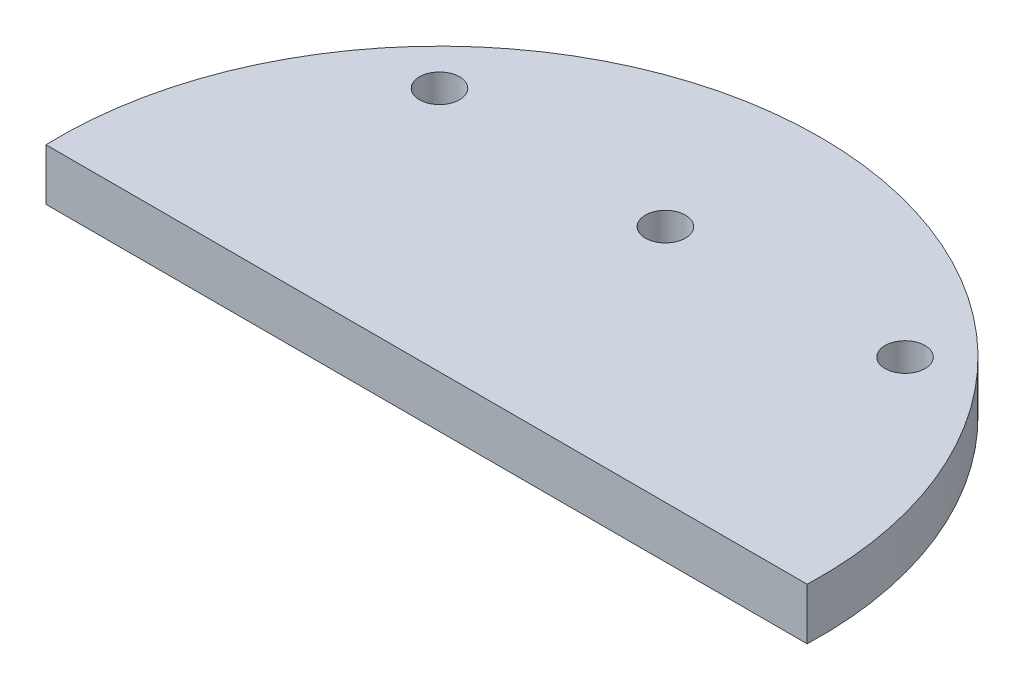
ISO-10303-21;
HEADER;
FILE_DESCRIPTION(('STEP AP214'),'2;1');
FILE_NAME('part.step','',(''),(''),'','','');
FILE_SCHEMA(('AUTOMOTIVE_DESIGN { 1 0 10303 214 1 1 1 1 }'));
ENDSEC;
DATA;
#1=APPLICATION_CONTEXT('core data for automotive mechanical design processes');
#2=APPLICATION_PROTOCOL_DEFINITION('international standard','automotive_design',2000,#1);
#3=PRODUCT_CONTEXT('',#1,'mechanical');
#4=PRODUCT('Part','Part','',(#3));
#5=PRODUCT_RELATED_PRODUCT_CATEGORY('part','',(#4));
#6=PRODUCT_DEFINITION_FORMATION('','',#4);
#7=PRODUCT_DEFINITION_CONTEXT('part definition',#1,'design');
#8=PRODUCT_DEFINITION('design','',#6,#7);
#9=PRODUCT_DEFINITION_SHAPE('','',#8);
#10=(LENGTH_UNIT() NAMED_UNIT(*) SI_UNIT(.MILLI.,.METRE.));
#11=(NAMED_UNIT(*) PLANE_ANGLE_UNIT() SI_UNIT($,.RADIAN.));
#12=(NAMED_UNIT(*) SI_UNIT($,.STERADIAN.) SOLID_ANGLE_UNIT());
#13=UNCERTAINTY_MEASURE_WITH_UNIT(LENGTH_MEASURE(1.E-05),#10,'distance_accuracy_value','');
#14=(GEOMETRIC_REPRESENTATION_CONTEXT(3) GLOBAL_UNCERTAINTY_ASSIGNED_CONTEXT((#13)) GLOBAL_UNIT_ASSIGNED_CONTEXT((#10,
#11,#12)) REPRESENTATION_CONTEXT('',''));
#15=CARTESIAN_POINT('',(0.,0.,0.));
#16=DIRECTION('',(0.,0.,1.));
#17=DIRECTION('',(1.,0.,0.));
#18=AXIS2_PLACEMENT_3D('',#15,#16,#17);
#19=CARTESIAN_POINT('',(-30.66172047433,-0.01,1.));
#20=DIRECTION('',(0.,0.,1.));
#21=DIRECTION('',(1.,0.,0.));
#22=AXIS2_PLACEMENT_3D('',#19,#20,#21);
#23=PLANE('',#22);
#24=DIRECTION('',(-1.,0.,0.));
#25=VECTOR('',#24,1.);
#26=CARTESIAN_POINT('',(-7.25,4.,1.));
#27=LINE('',#26,#25);
#28=CARTESIAN_POINT('',(29.4830459756111,4.,1.));
#29=VERTEX_POINT('',#28);
#30=CARTESIAN_POINT('',(-29.4830459756111,4.,1.));
#31=VERTEX_POINT('',#30);
#32=EDGE_CURVE('E53',#29,#31,#27,.T.);
#33=ORIENTED_EDGE('',*,*,#32,.T.);
#34=DIRECTION('',(0.,-1.,0.));
#35=VECTOR('',#34,1.);
#36=CARTESIAN_POINT('',(-29.4830459756111,4.,1.));
#37=LINE('',#36,#35);
#38=CARTESIAN_POINT('',(-29.4830459756111,0.,1.));
#39=VERTEX_POINT('',#38);
#40=EDGE_CURVE('E69',#31,#39,#37,.T.);
#41=ORIENTED_EDGE('',*,*,#40,.T.);
#42=DIRECTION('',(-1.,0.,0.));
#43=VECTOR('',#42,1.);
#44=CARTESIAN_POINT('',(-7.25,0.,1.));
#45=LINE('',#44,#43);
#46=CARTESIAN_POINT('',(29.4830459756111,0.,1.));
#47=VERTEX_POINT('',#46);
#48=EDGE_CURVE('E64',#47,#39,#45,.T.);
#49=ORIENTED_EDGE('',*,*,#48,.F.);
#50=DIRECTION('',(0.,-1.,0.));
#51=VECTOR('',#50,1.);
#52=CARTESIAN_POINT('',(29.4830459756111,4.,1.));
#53=LINE('',#52,#51);
#54=EDGE_CURVE('E67',#47,#29,#53,.F.);
#55=ORIENTED_EDGE('',*,*,#54,.T.);
#56=EDGE_LOOP('',(#33,#41,#49,#55));
#57=FACE_BOUND('',#56,.T.);
#58=ADVANCED_FACE('F37',(#57),#23,.T.);
#59=CARTESIAN_POINT('',(0.,4.,0.));
#60=DIRECTION('',(0.,-1.,0.));
#61=DIRECTION('',(0.,0.,-1.));
#62=AXIS2_PLACEMENT_3D('',#59,#60,#61);
#63=CYLINDRICAL_SURFACE('',#62,29.5);
#64=ORIENTED_EDGE('',*,*,#40,.F.);
#65=CARTESIAN_POINT('',(0.,4.,0.));
#66=DIRECTION('',(0.,1.,0.));
#67=DIRECTION('',(0.,0.,1.));
#68=AXIS2_PLACEMENT_3D('',#65,#66,#67);
#69=CIRCLE('',#68,29.5);
#70=EDGE_CURVE('E77',#29,#31,#69,.T.);
#71=ORIENTED_EDGE('',*,*,#70,.F.);
#72=ORIENTED_EDGE('',*,*,#54,.F.);
#73=CARTESIAN_POINT('',(0.,0.,0.));
#74=DIRECTION('',(0.,1.,0.));
#75=DIRECTION('',(0.,0.,1.));
#76=AXIS2_PLACEMENT_3D('',#73,#74,#75);
#77=CIRCLE('',#76,29.5);
#78=EDGE_CURVE('E41',#47,#39,#77,.T.);
#79=ORIENTED_EDGE('',*,*,#78,.T.);
#80=EDGE_LOOP('',(#64,#71,#72,#79));
#81=FACE_BOUND('',#80,.T.);
#82=ADVANCED_FACE('F78',(#81),#63,.T.);
#83=CARTESIAN_POINT('',(0.,4.,0.));
#84=DIRECTION('',(0.,1.,0.));
#85=DIRECTION('',(0.,0.,1.));
#86=AXIS2_PLACEMENT_3D('',#83,#84,#85);
#87=PLANE('',#86);
#88=CARTESIAN_POINT('',(-18.031222920257,4.,-18.0312229202569));
#89=DIRECTION('',(0.,1.,0.));
#90=DIRECTION('',(0.,0.,1.));
#91=AXIS2_PLACEMENT_3D('',#88,#89,#90);
#92=CIRCLE('',#91,1.55);
#93=CARTESIAN_POINT('',(-18.031222920257,4.,-16.4812229202569));
#94=VERTEX_POINT('',#93);
#95=EDGE_CURVE('E94',#94,#94,#92,.T.);
#96=ORIENTED_EDGE('',*,*,#95,.F.);
#97=EDGE_LOOP('',(#96));
#98=FACE_BOUND('',#97,.T.);
#99=CARTESIAN_POINT('',(18.0312229202567,4.,-18.0312229202572));
#100=DIRECTION('',(0.,1.,0.));
#101=DIRECTION('',(-1.,0.,0.));
#102=AXIS2_PLACEMENT_3D('',#99,#100,#101);
#103=CIRCLE('',#102,1.55);
#104=CARTESIAN_POINT('',(16.4812229202567,4.,-18.0312229202572));
#105=VERTEX_POINT('',#104);
#106=EDGE_CURVE('E72',#105,#105,#103,.T.);
#107=ORIENTED_EDGE('',*,*,#106,.F.);
#108=EDGE_LOOP('',(#107));
#109=FACE_BOUND('',#108,.T.);
#110=CARTESIAN_POINT('',(0.,4.,-17.5));
#111=DIRECTION('',(0.,1.,0.));
#112=DIRECTION('',(0.,0.,1.));
#113=AXIS2_PLACEMENT_3D('',#110,#111,#112);
#114=CIRCLE('',#113,1.55);
#115=CARTESIAN_POINT('',(0.,4.,-15.95));
#116=VERTEX_POINT('',#115);
#117=EDGE_CURVE('E11',#116,#116,#114,.T.);
#118=ORIENTED_EDGE('',*,*,#117,.F.);
#119=EDGE_LOOP('',(#118));
#120=FACE_BOUND('',#119,.T.);
#121=ORIENTED_EDGE('',*,*,#70,.T.);
#122=ORIENTED_EDGE('',*,*,#32,.F.);
#123=EDGE_LOOP('',(#121,#122));
#124=FACE_BOUND('',#123,.T.);
#125=ADVANCED_FACE('F39',(#98,#109,#120,#124),#87,.T.);
#126=CARTESIAN_POINT('',(0.,0.,0.));
#127=DIRECTION('',(0.,1.,0.));
#128=DIRECTION('',(0.,0.,1.));
#129=AXIS2_PLACEMENT_3D('',#126,#127,#128);
#130=PLANE('',#129);
#131=CARTESIAN_POINT('',(-18.031222920257,0.,-18.0312229202569));
#132=DIRECTION('',(0.,1.,0.));
#133=DIRECTION('',(0.,0.,1.));
#134=AXIS2_PLACEMENT_3D('',#131,#132,#133);
#135=CIRCLE('',#134,1.55);
#136=CARTESIAN_POINT('',(-18.031222920257,0.,-16.4812229202569));
#137=VERTEX_POINT('',#136);
#138=EDGE_CURVE('E76',#137,#137,#135,.T.);
#139=ORIENTED_EDGE('',*,*,#138,.T.);
#140=EDGE_LOOP('',(#139));
#141=FACE_BOUND('',#140,.T.);
#142=CARTESIAN_POINT('',(18.0312229202567,0.,-18.0312229202572));
#143=DIRECTION('',(0.,1.,0.));
#144=DIRECTION('',(-1.,0.,0.));
#145=AXIS2_PLACEMENT_3D('',#142,#143,#144);
#146=CIRCLE('',#145,1.55);
#147=CARTESIAN_POINT('',(16.4812229202567,0.,-18.0312229202572));
#148=VERTEX_POINT('',#147);
#149=EDGE_CURVE('E155',#148,#148,#146,.T.);
#150=ORIENTED_EDGE('',*,*,#149,.T.);
#151=EDGE_LOOP('',(#150));
#152=FACE_BOUND('',#151,.T.);
#153=CARTESIAN_POINT('',(0.,0.,-17.5));
#154=DIRECTION('',(0.,1.,0.));
#155=DIRECTION('',(0.,0.,1.));
#156=AXIS2_PLACEMENT_3D('',#153,#154,#155);
#157=CIRCLE('',#156,1.55);
#158=CARTESIAN_POINT('',(0.,0.,-15.95));
#159=VERTEX_POINT('',#158);
#160=EDGE_CURVE('E46',#159,#159,#157,.T.);
#161=ORIENTED_EDGE('',*,*,#160,.T.);
#162=EDGE_LOOP('',(#161));
#163=FACE_BOUND('',#162,.T.);
#164=ORIENTED_EDGE('',*,*,#48,.T.);
#165=ORIENTED_EDGE('',*,*,#78,.F.);
#166=EDGE_LOOP('',(#164,#165));
#167=FACE_BOUND('',#166,.T.);
#168=ADVANCED_FACE('F74',(#141,#152,#163,#167),#130,.F.);
#169=CARTESIAN_POINT('',(-18.031222920257,0.,-18.0312229202569));
#170=DIRECTION('',(0.,1.,0.));
#171=DIRECTION('',(0.,0.,1.));
#172=AXIS2_PLACEMENT_3D('',#169,#170,#171);
#173=CYLINDRICAL_SURFACE('',#172,1.55);
#174=ORIENTED_EDGE('',*,*,#138,.F.);
#175=EDGE_LOOP('',(#174));
#176=FACE_BOUND('',#175,.T.);
#177=ORIENTED_EDGE('',*,*,#95,.T.);
#178=EDGE_LOOP('',(#177));
#179=FACE_BOUND('',#178,.T.);
#180=ADVANCED_FACE('F88',(#176,#179),#173,.F.);
#181=CARTESIAN_POINT('',(18.0312229202567,0.,-18.0312229202572));
#182=DIRECTION('',(0.,1.,0.));
#183=DIRECTION('',(0.,0.,1.));
#184=AXIS2_PLACEMENT_3D('',#181,#182,#183);
#185=CYLINDRICAL_SURFACE('',#184,1.55);
#186=ORIENTED_EDGE('',*,*,#149,.F.);
#187=EDGE_LOOP('',(#186));
#188=FACE_BOUND('',#187,.T.);
#189=ORIENTED_EDGE('',*,*,#106,.T.);
#190=EDGE_LOOP('',(#189));
#191=FACE_BOUND('',#190,.T.);
#192=ADVANCED_FACE('F102',(#188,#191),#185,.F.);
#193=CARTESIAN_POINT('',(0.,0.,-17.5));
#194=DIRECTION('',(0.,1.,0.));
#195=DIRECTION('',(0.,0.,1.));
#196=AXIS2_PLACEMENT_3D('',#193,#194,#195);
#197=CYLINDRICAL_SURFACE('',#196,1.55);
#198=ORIENTED_EDGE('',*,*,#160,.F.);
#199=EDGE_LOOP('',(#198));
#200=FACE_BOUND('',#199,.T.);
#201=ORIENTED_EDGE('',*,*,#117,.T.);
#202=EDGE_LOOP('',(#201));
#203=FACE_BOUND('',#202,.T.);
#204=ADVANCED_FACE('F100',(#200,#203),#197,.F.);
#205=CLOSED_SHELL('',(#58,#82,#125,#168,#180,#192,#204));
#206=MANIFOLD_SOLID_BREP('B2',#205);
#207=ADVANCED_BREP_SHAPE_REPRESENTATION('',(#18,#206),#14);
#208=SHAPE_DEFINITION_REPRESENTATION(#9,#207);
ENDSEC;
END-ISO-10303-21;
